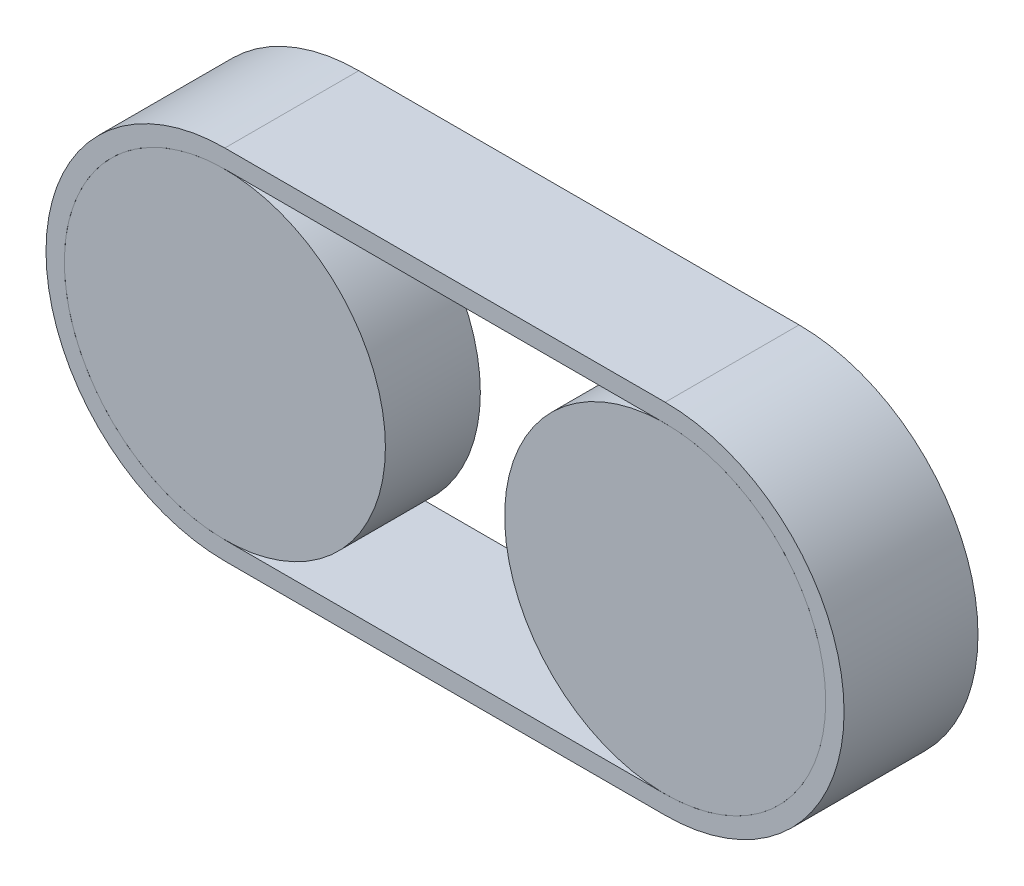
ISO-10303-21;
HEADER;
FILE_DESCRIPTION(('STEP AP214'),'2;1');
FILE_NAME('part.step','',(''),(''),'','','');
FILE_SCHEMA(('AUTOMOTIVE_DESIGN { 1 0 10303 214 1 1 1 1 }'));
ENDSEC;
DATA;
#1=APPLICATION_CONTEXT('core data for automotive mechanical design processes');
#2=APPLICATION_PROTOCOL_DEFINITION('international standard','automotive_design',2000,#1);
#3=PRODUCT_CONTEXT('',#1,'mechanical');
#4=PRODUCT('Part','Part','',(#3));
#5=PRODUCT_RELATED_PRODUCT_CATEGORY('part','',(#4));
#6=PRODUCT_DEFINITION_FORMATION('','',#4);
#7=PRODUCT_DEFINITION_CONTEXT('part definition',#1,'design');
#8=PRODUCT_DEFINITION('design','',#6,#7);
#9=PRODUCT_DEFINITION_SHAPE('','',#8);
#10=(LENGTH_UNIT() NAMED_UNIT(*) SI_UNIT(.MILLI.,.METRE.));
#11=(NAMED_UNIT(*) PLANE_ANGLE_UNIT() SI_UNIT($,.RADIAN.));
#12=(NAMED_UNIT(*) SI_UNIT($,.STERADIAN.) SOLID_ANGLE_UNIT());
#13=UNCERTAINTY_MEASURE_WITH_UNIT(LENGTH_MEASURE(1.E-05),#10,'distance_accuracy_value','');
#14=(GEOMETRIC_REPRESENTATION_CONTEXT(3) GLOBAL_UNCERTAINTY_ASSIGNED_CONTEXT((#13)) GLOBAL_UNIT_ASSIGNED_CONTEXT((#10,
#11,#12)) REPRESENTATION_CONTEXT('',''));
#15=CARTESIAN_POINT('',(0.,0.,0.));
#16=DIRECTION('',(0.,0.,1.));
#17=DIRECTION('',(1.,0.,0.));
#18=AXIS2_PLACEMENT_3D('',#15,#16,#17);
#19=CARTESIAN_POINT('',(24.,0.,4.25));
#20=DIRECTION('',(0.,0.,1.));
#21=DIRECTION('',(1.,0.,0.));
#22=AXIS2_PLACEMENT_3D('',#19,#20,#21);
#23=CYLINDRICAL_SURFACE('',#22,17.5);
#24=CARTESIAN_POINT('',(24.,0.,4.25));
#25=DIRECTION('',(0.,0.,1.));
#26=DIRECTION('',(1.,0.,0.));
#27=AXIS2_PLACEMENT_3D('',#24,#25,#26);
#28=CIRCLE('',#27,17.5);
#29=CARTESIAN_POINT('',(41.5,0.,4.25));
#30=VERTEX_POINT('',#29);
#31=EDGE_CURVE('E11',#30,#30,#28,.T.);
#32=ORIENTED_EDGE('',*,*,#31,.T.);
#33=EDGE_LOOP('',(#32));
#34=FACE_BOUND('',#33,.T.);
#35=CARTESIAN_POINT('',(24.,0.,14.6));
#36=DIRECTION('',(0.,0.,1.));
#37=DIRECTION('',(1.,0.,0.));
#38=AXIS2_PLACEMENT_3D('',#35,#36,#37);
#39=CIRCLE('',#38,17.5);
#40=CARTESIAN_POINT('',(41.5,0.,14.6));
#41=VERTEX_POINT('',#40);
#42=EDGE_CURVE('E45',#41,#41,#39,.T.);
#43=ORIENTED_EDGE('',*,*,#42,.F.);
#44=EDGE_LOOP('',(#43));
#45=FACE_BOUND('',#44,.T.);
#46=ADVANCED_FACE('F42',(#34,#45),#23,.T.);
#47=CARTESIAN_POINT('',(24.,0.,4.25));
#48=DIRECTION('',(0.,0.,1.));
#49=DIRECTION('',(1.,0.,0.));
#50=AXIS2_PLACEMENT_3D('',#47,#48,#49);
#51=PLANE('',#50);
#52=ORIENTED_EDGE('',*,*,#31,.F.);
#53=EDGE_LOOP('',(#52));
#54=FACE_BOUND('',#53,.T.);
#55=ADVANCED_FACE('F57',(#54),#51,.F.);
#56=CARTESIAN_POINT('',(24.,0.,14.6));
#57=DIRECTION('',(0.,0.,1.));
#58=DIRECTION('',(1.,0.,0.));
#59=AXIS2_PLACEMENT_3D('',#56,#57,#58);
#60=PLANE('',#59);
#61=ORIENTED_EDGE('',*,*,#42,.T.);
#62=EDGE_LOOP('',(#61));
#63=FACE_BOUND('',#62,.T.);
#64=ADVANCED_FACE('F54',(#63),#60,.T.);
#65=CLOSED_SHELL('',(#46,#55,#64));
#66=MANIFOLD_SOLID_BREP('B2',#65);
#67=CARTESIAN_POINT('',(-24.,0.,4.25));
#68=DIRECTION('',(0.,0.,1.));
#69=DIRECTION('',(1.,0.,0.));
#70=AXIS2_PLACEMENT_3D('',#67,#68,#69);
#71=CYLINDRICAL_SURFACE('',#70,17.5);
#72=CARTESIAN_POINT('',(-24.,0.,4.25));
#73=DIRECTION('',(0.,0.,1.));
#74=DIRECTION('',(1.,0.,0.));
#75=AXIS2_PLACEMENT_3D('',#72,#73,#74);
#76=CIRCLE('',#75,17.5);
#77=CARTESIAN_POINT('',(-6.5,0.,4.25));
#78=VERTEX_POINT('',#77);
#79=EDGE_CURVE('E41',#78,#78,#76,.T.);
#80=ORIENTED_EDGE('',*,*,#79,.T.);
#81=EDGE_LOOP('',(#80));
#82=FACE_BOUND('',#81,.T.);
#83=CARTESIAN_POINT('',(-24.,0.,14.6));
#84=DIRECTION('',(0.,0.,1.));
#85=DIRECTION('',(1.,0.,0.));
#86=AXIS2_PLACEMENT_3D('',#83,#84,#85);
#87=CIRCLE('',#86,17.5);
#88=CARTESIAN_POINT('',(-6.5,0.,14.6));
#89=VERTEX_POINT('',#88);
#90=EDGE_CURVE('E101',#89,#89,#87,.T.);
#91=ORIENTED_EDGE('',*,*,#90,.F.);
#92=EDGE_LOOP('',(#91));
#93=FACE_BOUND('',#92,.T.);
#94=ADVANCED_FACE('F98',(#82,#93),#71,.T.);
#95=CARTESIAN_POINT('',(-24.,0.,4.25));
#96=DIRECTION('',(0.,0.,1.));
#97=DIRECTION('',(1.,0.,0.));
#98=AXIS2_PLACEMENT_3D('',#95,#96,#97);
#99=PLANE('',#98);
#100=ORIENTED_EDGE('',*,*,#79,.F.);
#101=EDGE_LOOP('',(#100));
#102=FACE_BOUND('',#101,.T.);
#103=ADVANCED_FACE('F113',(#102),#99,.F.);
#104=CARTESIAN_POINT('',(-24.,0.,14.6));
#105=DIRECTION('',(0.,0.,1.));
#106=DIRECTION('',(1.,0.,0.));
#107=AXIS2_PLACEMENT_3D('',#104,#105,#106);
#108=PLANE('',#107);
#109=ORIENTED_EDGE('',*,*,#90,.T.);
#110=EDGE_LOOP('',(#109));
#111=FACE_BOUND('',#110,.T.);
#112=ADVANCED_FACE('F110',(#111),#108,.T.);
#113=CLOSED_SHELL('',(#94,#103,#112));
#114=MANIFOLD_SOLID_BREP('B6',#113);
#115=CARTESIAN_POINT('',(-24.,0.,14.6));
#116=DIRECTION('',(0.,0.,1.));
#117=DIRECTION('',(1.,0.,0.));
#118=AXIS2_PLACEMENT_3D('',#115,#116,#117);
#119=PLANE('',#118);
#120=CARTESIAN_POINT('',(-24.,0.,14.6));
#121=DIRECTION('',(0.,0.,1.));
#122=DIRECTION('',(1.,0.,0.));
#123=AXIS2_PLACEMENT_3D('',#120,#121,#122);
#124=CIRCLE('',#123,19.5);
#125=CARTESIAN_POINT('',(-24.,19.5,14.6));
#126=VERTEX_POINT('',#125);
#127=CARTESIAN_POINT('',(-24.,-19.5,14.6));
#128=VERTEX_POINT('',#127);
#129=EDGE_CURVE('E246',#126,#128,#124,.T.);
#130=ORIENTED_EDGE('',*,*,#129,.T.);
#131=DIRECTION('',(1.,0.,0.));
#132=VECTOR('',#131,1.);
#133=CARTESIAN_POINT('',(-24.,-19.5,14.6));
#134=LINE('',#133,#132);
#135=CARTESIAN_POINT('',(24.,-19.5,14.6));
#136=VERTEX_POINT('',#135);
#137=EDGE_CURVE('E249',#128,#136,#134,.T.);
#138=ORIENTED_EDGE('',*,*,#137,.T.);
#139=CARTESIAN_POINT('',(24.,0.,14.6));
#140=DIRECTION('',(0.,0.,1.));
#141=DIRECTION('',(1.,0.,0.));
#142=AXIS2_PLACEMENT_3D('',#139,#140,#141);
#143=CIRCLE('',#142,19.5);
#144=CARTESIAN_POINT('',(24.,19.5,14.6));
#145=VERTEX_POINT('',#144);
#146=EDGE_CURVE('E252',#136,#145,#143,.T.);
#147=ORIENTED_EDGE('',*,*,#146,.T.);
#148=DIRECTION('',(-1.,0.,0.));
#149=VECTOR('',#148,1.);
#150=CARTESIAN_POINT('',(-24.,19.5,14.6));
#151=LINE('',#150,#149);
#152=EDGE_CURVE('E254',#145,#126,#151,.T.);
#153=ORIENTED_EDGE('',*,*,#152,.T.);
#154=EDGE_LOOP('',(#130,#138,#147,#153));
#155=FACE_BOUND('',#154,.T.);
#156=DIRECTION('',(-1.,0.,0.));
#157=VECTOR('',#156,1.);
#158=CARTESIAN_POINT('',(24.,17.5,14.6));
#159=LINE('',#158,#157);
#160=CARTESIAN_POINT('',(24.,17.5,14.6));
#161=VERTEX_POINT('',#160);
#162=CARTESIAN_POINT('',(-24.,17.5,14.6));
#163=VERTEX_POINT('',#162);
#164=EDGE_CURVE('E218',#161,#163,#159,.T.);
#165=ORIENTED_EDGE('',*,*,#164,.F.);
#166=CARTESIAN_POINT('',(24.,0.,14.6));
#167=DIRECTION('',(0.,0.,1.));
#168=DIRECTION('',(1.,0.,0.));
#169=AXIS2_PLACEMENT_3D('',#166,#167,#168);
#170=CIRCLE('',#169,17.5);
#171=CARTESIAN_POINT('',(24.,-17.5,14.6));
#172=VERTEX_POINT('',#171);
#173=EDGE_CURVE('E210',#172,#161,#170,.T.);
#174=ORIENTED_EDGE('',*,*,#173,.F.);
#175=DIRECTION('',(1.,0.,0.));
#176=VECTOR('',#175,1.);
#177=CARTESIAN_POINT('',(24.,-17.5,14.6));
#178=LINE('',#177,#176);
#179=CARTESIAN_POINT('',(-24.,-17.5,14.6));
#180=VERTEX_POINT('',#179);
#181=EDGE_CURVE('E232',#180,#172,#178,.T.);
#182=ORIENTED_EDGE('',*,*,#181,.F.);
#183=CARTESIAN_POINT('',(-24.,0.,14.6));
#184=DIRECTION('',(0.,0.,1.));
#185=DIRECTION('',(1.,0.,0.));
#186=AXIS2_PLACEMENT_3D('',#183,#184,#185);
#187=CIRCLE('',#186,17.5);
#188=EDGE_CURVE('E230',#163,#180,#187,.T.);
#189=ORIENTED_EDGE('',*,*,#188,.F.);
#190=EDGE_LOOP('',(#165,#174,#182,#189));
#191=FACE_BOUND('',#190,.T.);
#192=ADVANCED_FACE('F145',(#155,#191),#119,.T.);
#193=CARTESIAN_POINT('',(-24.,0.,0.));
#194=DIRECTION('',(0.,0.,1.));
#195=DIRECTION('',(1.,0.,0.));
#196=AXIS2_PLACEMENT_3D('',#193,#194,#195);
#197=PLANE('',#196);
#198=CARTESIAN_POINT('',(-24.,0.,0.));
#199=DIRECTION('',(0.,0.,1.));
#200=DIRECTION('',(1.,0.,0.));
#201=AXIS2_PLACEMENT_3D('',#198,#199,#200);
#202=CIRCLE('',#201,19.5);
#203=CARTESIAN_POINT('',(-24.,19.5,0.));
#204=VERTEX_POINT('',#203);
#205=CARTESIAN_POINT('',(-24.,-19.5,0.));
#206=VERTEX_POINT('',#205);
#207=EDGE_CURVE('E226',#204,#206,#202,.T.);
#208=ORIENTED_EDGE('',*,*,#207,.F.);
#209=DIRECTION('',(-1.,0.,0.));
#210=VECTOR('',#209,1.);
#211=CARTESIAN_POINT('',(-24.,19.5,0.));
#212=LINE('',#211,#210);
#213=CARTESIAN_POINT('',(24.,19.5,0.));
#214=VERTEX_POINT('',#213);
#215=EDGE_CURVE('E250',#214,#204,#212,.T.);
#216=ORIENTED_EDGE('',*,*,#215,.F.);
#217=CARTESIAN_POINT('',(24.,0.,0.));
#218=DIRECTION('',(0.,0.,1.));
#219=DIRECTION('',(1.,0.,0.));
#220=AXIS2_PLACEMENT_3D('',#217,#218,#219);
#221=CIRCLE('',#220,19.5);
#222=CARTESIAN_POINT('',(24.,-19.5,0.));
#223=VERTEX_POINT('',#222);
#224=EDGE_CURVE('E261',#223,#214,#221,.T.);
#225=ORIENTED_EDGE('',*,*,#224,.F.);
#226=DIRECTION('',(1.,0.,0.));
#227=VECTOR('',#226,1.);
#228=CARTESIAN_POINT('',(-24.,-19.5,0.));
#229=LINE('',#228,#227);
#230=EDGE_CURVE('E259',#206,#223,#229,.T.);
#231=ORIENTED_EDGE('',*,*,#230,.F.);
#232=EDGE_LOOP('',(#208,#216,#225,#231));
#233=FACE_BOUND('',#232,.T.);
#234=CARTESIAN_POINT('',(24.,0.,0.));
#235=DIRECTION('',(0.,0.,1.));
#236=DIRECTION('',(1.,0.,0.));
#237=AXIS2_PLACEMENT_3D('',#234,#235,#236);
#238=CIRCLE('',#237,17.5);
#239=CARTESIAN_POINT('',(24.,-17.5,0.));
#240=VERTEX_POINT('',#239);
#241=CARTESIAN_POINT('',(24.,17.5,0.));
#242=VERTEX_POINT('',#241);
#243=EDGE_CURVE('E168',#240,#242,#238,.T.);
#244=ORIENTED_EDGE('',*,*,#243,.T.);
#245=DIRECTION('',(-1.,0.,0.));
#246=VECTOR('',#245,1.);
#247=CARTESIAN_POINT('',(24.,17.5,0.));
#248=LINE('',#247,#246);
#249=CARTESIAN_POINT('',(-24.,17.5,0.));
#250=VERTEX_POINT('',#249);
#251=EDGE_CURVE('E225',#242,#250,#248,.T.);
#252=ORIENTED_EDGE('',*,*,#251,.T.);
#253=CARTESIAN_POINT('',(-24.,0.,0.));
#254=DIRECTION('',(0.,0.,1.));
#255=DIRECTION('',(1.,0.,0.));
#256=AXIS2_PLACEMENT_3D('',#253,#254,#255);
#257=CIRCLE('',#256,17.5);
#258=CARTESIAN_POINT('',(-24.,-17.5,0.));
#259=VERTEX_POINT('',#258);
#260=EDGE_CURVE('E238',#250,#259,#257,.T.);
#261=ORIENTED_EDGE('',*,*,#260,.T.);
#262=DIRECTION('',(1.,0.,0.));
#263=VECTOR('',#262,1.);
#264=CARTESIAN_POINT('',(24.,-17.5,0.));
#265=LINE('',#264,#263);
#266=EDGE_CURVE('E219',#259,#240,#265,.T.);
#267=ORIENTED_EDGE('',*,*,#266,.T.);
#268=EDGE_LOOP('',(#244,#252,#261,#267));
#269=FACE_BOUND('',#268,.T.);
#270=ADVANCED_FACE('F279',(#233,#269),#197,.F.);
#271=CARTESIAN_POINT('',(-24.,0.,14.6));
#272=DIRECTION('',(0.,0.,-1.));
#273=DIRECTION('',(-1.,0.,0.));
#274=AXIS2_PLACEMENT_3D('',#271,#272,#273);
#275=CYLINDRICAL_SURFACE('',#274,19.5);
#276=ORIENTED_EDGE('',*,*,#207,.T.);
#277=DIRECTION('',(0.,0.,-1.));
#278=VECTOR('',#277,1.);
#279=CARTESIAN_POINT('',(-24.,-19.5,14.6));
#280=LINE('',#279,#278);
#281=EDGE_CURVE('E96',#128,#206,#280,.T.);
#282=ORIENTED_EDGE('',*,*,#281,.F.);
#283=ORIENTED_EDGE('',*,*,#129,.F.);
#284=DIRECTION('',(0.,0.,-1.));
#285=VECTOR('',#284,1.);
#286=CARTESIAN_POINT('',(-24.,19.5,14.6));
#287=LINE('',#286,#285);
#288=EDGE_CURVE('E256',#126,#204,#287,.T.);
#289=ORIENTED_EDGE('',*,*,#288,.T.);
#290=EDGE_LOOP('',(#276,#282,#283,#289));
#291=FACE_BOUND('',#290,.T.);
#292=ADVANCED_FACE('F147',(#291),#275,.T.);
#293=CARTESIAN_POINT('',(-24.,-19.5,14.6));
#294=DIRECTION('',(0.,1.,0.));
#295=DIRECTION('',(0.,0.,1.));
#296=AXIS2_PLACEMENT_3D('',#293,#294,#295);
#297=PLANE('',#296);
#298=ORIENTED_EDGE('',*,*,#230,.T.);
#299=DIRECTION('',(0.,0.,-1.));
#300=VECTOR('',#299,1.);
#301=CARTESIAN_POINT('',(24.,-19.5,14.6));
#302=LINE('',#301,#300);
#303=EDGE_CURVE('E153',#136,#223,#302,.T.);
#304=ORIENTED_EDGE('',*,*,#303,.F.);
#305=ORIENTED_EDGE('',*,*,#137,.F.);
#306=ORIENTED_EDGE('',*,*,#281,.T.);
#307=EDGE_LOOP('',(#298,#304,#305,#306));
#308=FACE_BOUND('',#307,.T.);
#309=ADVANCED_FACE('F289',(#308),#297,.F.);
#310=CARTESIAN_POINT('',(24.,0.,14.6));
#311=DIRECTION('',(0.,0.,-1.));
#312=DIRECTION('',(-1.,0.,0.));
#313=AXIS2_PLACEMENT_3D('',#310,#311,#312);
#314=CYLINDRICAL_SURFACE('',#313,19.5);
#315=ORIENTED_EDGE('',*,*,#224,.T.);
#316=DIRECTION('',(0.,0.,-1.));
#317=VECTOR('',#316,1.);
#318=CARTESIAN_POINT('',(24.,19.5,14.6));
#319=LINE('',#318,#317);
#320=EDGE_CURVE('E266',#145,#214,#319,.T.);
#321=ORIENTED_EDGE('',*,*,#320,.F.);
#322=ORIENTED_EDGE('',*,*,#146,.F.);
#323=ORIENTED_EDGE('',*,*,#303,.T.);
#324=EDGE_LOOP('',(#315,#321,#322,#323));
#325=FACE_BOUND('',#324,.T.);
#326=ADVANCED_FACE('F273',(#325),#314,.T.);
#327=CARTESIAN_POINT('',(-24.,19.5,14.6));
#328=DIRECTION('',(0.,-1.,0.));
#329=DIRECTION('',(0.,0.,-1.));
#330=AXIS2_PLACEMENT_3D('',#327,#328,#329);
#331=PLANE('',#330);
#332=ORIENTED_EDGE('',*,*,#215,.T.);
#333=ORIENTED_EDGE('',*,*,#288,.F.);
#334=ORIENTED_EDGE('',*,*,#152,.F.);
#335=ORIENTED_EDGE('',*,*,#320,.T.);
#336=EDGE_LOOP('',(#332,#333,#334,#335));
#337=FACE_BOUND('',#336,.T.);
#338=ADVANCED_FACE('F283',(#337),#331,.F.);
#339=CARTESIAN_POINT('',(24.,0.,14.6));
#340=DIRECTION('',(0.,0.,-1.));
#341=DIRECTION('',(-1.,0.,0.));
#342=AXIS2_PLACEMENT_3D('',#339,#340,#341);
#343=CYLINDRICAL_SURFACE('',#342,17.5);
#344=ORIENTED_EDGE('',*,*,#243,.F.);
#345=DIRECTION('',(0.,0.,-1.));
#346=VECTOR('',#345,1.);
#347=CARTESIAN_POINT('',(24.,-17.5,14.6));
#348=LINE('',#347,#346);
#349=EDGE_CURVE('E214',#172,#240,#348,.T.);
#350=ORIENTED_EDGE('',*,*,#349,.F.);
#351=ORIENTED_EDGE('',*,*,#173,.T.);
#352=DIRECTION('',(0.,0.,-1.));
#353=VECTOR('',#352,1.);
#354=CARTESIAN_POINT('',(24.,17.5,14.6));
#355=LINE('',#354,#353);
#356=EDGE_CURVE('E213',#161,#242,#355,.T.);
#357=ORIENTED_EDGE('',*,*,#356,.T.);
#358=EDGE_LOOP('',(#344,#350,#351,#357));
#359=FACE_BOUND('',#358,.T.);
#360=ADVANCED_FACE('F212',(#359),#343,.F.);
#361=CARTESIAN_POINT('',(24.,17.5,14.6));
#362=DIRECTION('',(0.,-1.,0.));
#363=DIRECTION('',(1.,0.,0.));
#364=AXIS2_PLACEMENT_3D('',#361,#362,#363);
#365=PLANE('',#364);
#366=ORIENTED_EDGE('',*,*,#251,.F.);
#367=ORIENTED_EDGE('',*,*,#356,.F.);
#368=ORIENTED_EDGE('',*,*,#164,.T.);
#369=DIRECTION('',(0.,0.,-1.));
#370=VECTOR('',#369,1.);
#371=CARTESIAN_POINT('',(-24.,17.5,14.6));
#372=LINE('',#371,#370);
#373=EDGE_CURVE('E227',#163,#250,#372,.T.);
#374=ORIENTED_EDGE('',*,*,#373,.T.);
#375=EDGE_LOOP('',(#366,#367,#368,#374));
#376=FACE_BOUND('',#375,.T.);
#377=ADVANCED_FACE('F222',(#376),#365,.T.);
#378=CARTESIAN_POINT('',(-24.,0.,14.6));
#379=DIRECTION('',(0.,0.,-1.));
#380=DIRECTION('',(-1.,0.,0.));
#381=AXIS2_PLACEMENT_3D('',#378,#379,#380);
#382=CYLINDRICAL_SURFACE('',#381,17.5);
#383=ORIENTED_EDGE('',*,*,#260,.F.);
#384=ORIENTED_EDGE('',*,*,#373,.F.);
#385=ORIENTED_EDGE('',*,*,#188,.T.);
#386=DIRECTION('',(0.,0.,-1.));
#387=VECTOR('',#386,1.);
#388=CARTESIAN_POINT('',(-24.,-17.5,14.6));
#389=LINE('',#388,#387);
#390=EDGE_CURVE('E160',#180,#259,#389,.T.);
#391=ORIENTED_EDGE('',*,*,#390,.T.);
#392=EDGE_LOOP('',(#383,#384,#385,#391));
#393=FACE_BOUND('',#392,.T.);
#394=ADVANCED_FACE('F312',(#393),#382,.F.);
#395=CARTESIAN_POINT('',(24.,-17.5,14.6));
#396=DIRECTION('',(0.,1.,0.));
#397=DIRECTION('',(-1.,0.,0.));
#398=AXIS2_PLACEMENT_3D('',#395,#396,#397);
#399=PLANE('',#398);
#400=ORIENTED_EDGE('',*,*,#266,.F.);
#401=ORIENTED_EDGE('',*,*,#390,.F.);
#402=ORIENTED_EDGE('',*,*,#181,.T.);
#403=ORIENTED_EDGE('',*,*,#349,.T.);
#404=EDGE_LOOP('',(#400,#401,#402,#403));
#405=FACE_BOUND('',#404,.T.);
#406=ADVANCED_FACE('F316',(#405),#399,.T.);
#407=CLOSED_SHELL('',(#192,#270,#292,#309,#326,#338,#360,#377,#394,#406));
#408=MANIFOLD_SOLID_BREP('B36',#407);
#409=ADVANCED_BREP_SHAPE_REPRESENTATION('',(#18,#66,#114,#408),#14);
#410=SHAPE_DEFINITION_REPRESENTATION(#9,#409);
ENDSEC;
END-ISO-10303-21;
